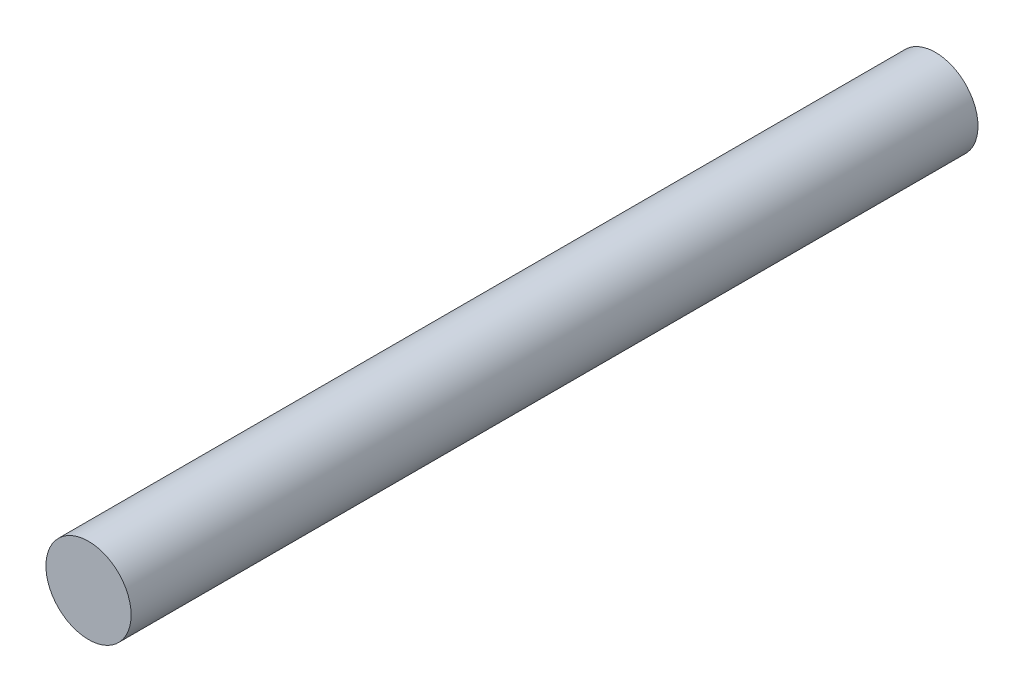
ISO-10303-21;
HEADER;
FILE_DESCRIPTION(('STEP AP214'),'2;1');
FILE_NAME('part.step','',(''),(''),'','','');
FILE_SCHEMA(('AUTOMOTIVE_DESIGN { 1 0 10303 214 1 1 1 1 }'));
ENDSEC;
DATA;
#1=APPLICATION_CONTEXT('core data for automotive mechanical design processes');
#2=APPLICATION_PROTOCOL_DEFINITION('international standard','automotive_design',2000,#1);
#3=PRODUCT_CONTEXT('',#1,'mechanical');
#4=PRODUCT('Part','Part','',(#3));
#5=PRODUCT_RELATED_PRODUCT_CATEGORY('part','',(#4));
#6=PRODUCT_DEFINITION_FORMATION('','',#4);
#7=PRODUCT_DEFINITION_CONTEXT('part definition',#1,'design');
#8=PRODUCT_DEFINITION('design','',#6,#7);
#9=PRODUCT_DEFINITION_SHAPE('','',#8);
#10=(LENGTH_UNIT() NAMED_UNIT(*) SI_UNIT(.MILLI.,.METRE.));
#11=(NAMED_UNIT(*) PLANE_ANGLE_UNIT() SI_UNIT($,.RADIAN.));
#12=(NAMED_UNIT(*) SI_UNIT($,.STERADIAN.) SOLID_ANGLE_UNIT());
#13=UNCERTAINTY_MEASURE_WITH_UNIT(LENGTH_MEASURE(1.E-05),#10,'distance_accuracy_value','');
#14=(GEOMETRIC_REPRESENTATION_CONTEXT(3) GLOBAL_UNCERTAINTY_ASSIGNED_CONTEXT((#13)) GLOBAL_UNIT_ASSIGNED_CONTEXT((#10,
#11,#12)) REPRESENTATION_CONTEXT('',''));
#15=CARTESIAN_POINT('',(0.,0.,0.));
#16=DIRECTION('',(0.,0.,1.));
#17=DIRECTION('',(1.,0.,0.));
#18=AXIS2_PLACEMENT_3D('',#15,#16,#17);
#19=CARTESIAN_POINT('',(0.,0.,63.1346));
#20=DIRECTION('',(0.,0.,-1.));
#21=DIRECTION('',(-1.,0.,0.));
#22=AXIS2_PLACEMENT_3D('',#19,#20,#21);
#23=CYLINDRICAL_SURFACE('',#22,3.175);
#24=CARTESIAN_POINT('',(0.,0.,63.1346));
#25=DIRECTION('',(0.,0.,1.));
#26=DIRECTION('',(1.,0.,0.));
#27=AXIS2_PLACEMENT_3D('',#24,#25,#26);
#28=CIRCLE('',#27,3.175);
#29=CARTESIAN_POINT('',(3.175,0.,63.1346));
#30=VERTEX_POINT('',#29);
#31=EDGE_CURVE('E10',#30,#30,#28,.T.);
#32=ORIENTED_EDGE('',*,*,#31,.F.);
#33=EDGE_LOOP('',(#32));
#34=FACE_BOUND('',#33,.T.);
#35=CARTESIAN_POINT('',(0.,0.,0.));
#36=DIRECTION('',(0.,0.,1.));
#37=DIRECTION('',(1.,0.,0.));
#38=AXIS2_PLACEMENT_3D('',#35,#36,#37);
#39=CIRCLE('',#38,3.175);
#40=CARTESIAN_POINT('',(3.175,0.,0.));
#41=VERTEX_POINT('',#40);
#42=EDGE_CURVE('E44',#41,#41,#39,.T.);
#43=ORIENTED_EDGE('',*,*,#42,.T.);
#44=EDGE_LOOP('',(#43));
#45=FACE_BOUND('',#44,.T.);
#46=ADVANCED_FACE('F41',(#34,#45),#23,.T.);
#47=CARTESIAN_POINT('',(0.,0.,63.1346));
#48=DIRECTION('',(0.,0.,1.));
#49=DIRECTION('',(1.,0.,0.));
#50=AXIS2_PLACEMENT_3D('',#47,#48,#49);
#51=PLANE('',#50);
#52=ORIENTED_EDGE('',*,*,#31,.T.);
#53=EDGE_LOOP('',(#52));
#54=FACE_BOUND('',#53,.T.);
#55=ADVANCED_FACE('F58',(#54),#51,.T.);
#56=CARTESIAN_POINT('',(0.,0.,0.));
#57=DIRECTION('',(0.,0.,1.));
#58=DIRECTION('',(1.,0.,0.));
#59=AXIS2_PLACEMENT_3D('',#56,#57,#58);
#60=PLANE('',#59);
#61=ORIENTED_EDGE('',*,*,#42,.F.);
#62=EDGE_LOOP('',(#61));
#63=FACE_BOUND('',#62,.T.);
#64=ADVANCED_FACE('F56',(#63),#60,.F.);
#65=CLOSED_SHELL('',(#46,#55,#64));
#66=MANIFOLD_SOLID_BREP('B2',#65);
#67=ADVANCED_BREP_SHAPE_REPRESENTATION('',(#18,#66),#14);
#68=SHAPE_DEFINITION_REPRESENTATION(#9,#67);
ENDSEC;
END-ISO-10303-21;
